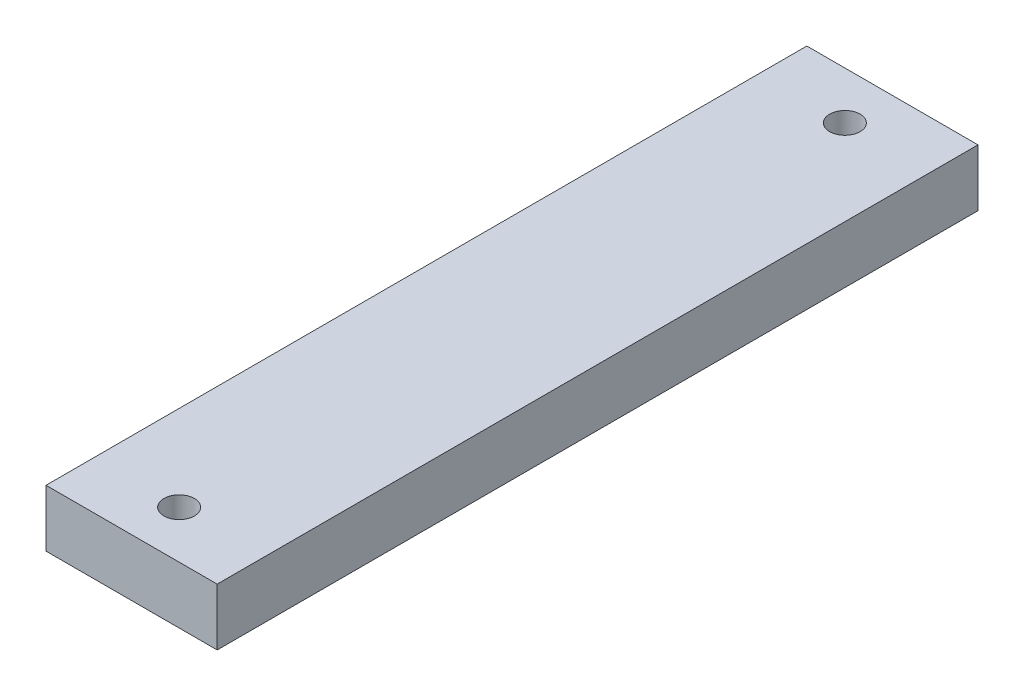
ISO-10303-21;
HEADER;
FILE_DESCRIPTION(('STEP AP214'),'2;1');
FILE_NAME('part.step','',(''),(''),'','','');
FILE_SCHEMA(('AUTOMOTIVE_DESIGN { 1 0 10303 214 1 1 1 1 }'));
ENDSEC;
DATA;
#1=APPLICATION_CONTEXT('core data for automotive mechanical design processes');
#2=APPLICATION_PROTOCOL_DEFINITION('international standard','automotive_design',2000,#1);
#3=PRODUCT_CONTEXT('',#1,'mechanical');
#4=PRODUCT('Part','Part','',(#3));
#5=PRODUCT_RELATED_PRODUCT_CATEGORY('part','',(#4));
#6=PRODUCT_DEFINITION_FORMATION('','',#4);
#7=PRODUCT_DEFINITION_CONTEXT('part definition',#1,'design');
#8=PRODUCT_DEFINITION('design','',#6,#7);
#9=PRODUCT_DEFINITION_SHAPE('','',#8);
#10=(LENGTH_UNIT() NAMED_UNIT(*) SI_UNIT(.MILLI.,.METRE.));
#11=(NAMED_UNIT(*) PLANE_ANGLE_UNIT() SI_UNIT($,.RADIAN.));
#12=(NAMED_UNIT(*) SI_UNIT($,.STERADIAN.) SOLID_ANGLE_UNIT());
#13=UNCERTAINTY_MEASURE_WITH_UNIT(LENGTH_MEASURE(1.E-05),#10,'distance_accuracy_value','');
#14=(GEOMETRIC_REPRESENTATION_CONTEXT(3) GLOBAL_UNCERTAINTY_ASSIGNED_CONTEXT((#13)) GLOBAL_UNIT_ASSIGNED_CONTEXT((#10,
#11,#12)) REPRESENTATION_CONTEXT('',''));
#15=CARTESIAN_POINT('',(0.,0.,0.));
#16=DIRECTION('',(0.,0.,1.));
#17=DIRECTION('',(1.,0.,0.));
#18=AXIS2_PLACEMENT_3D('',#15,#16,#17);
#19=CARTESIAN_POINT('',(0.,6.,0.));
#20=DIRECTION('',(0.,-1.,0.));
#21=DIRECTION('',(0.,0.,-1.));
#22=AXIS2_PLACEMENT_3D('',#19,#20,#21);
#23=PLANE('',#22);
#24=DIRECTION('',(0.,0.,-1.));
#25=VECTOR('',#24,1.);
#26=CARTESIAN_POINT('',(9.,6.,40.));
#27=LINE('',#26,#25);
#28=CARTESIAN_POINT('',(9.,6.,40.));
#29=VERTEX_POINT('',#28);
#30=CARTESIAN_POINT('',(9.,6.,-40.));
#31=VERTEX_POINT('',#30);
#32=EDGE_CURVE('E98',#29,#31,#27,.T.);
#33=ORIENTED_EDGE('',*,*,#32,.T.);
#34=DIRECTION('',(-1.,0.,0.));
#35=VECTOR('',#34,1.);
#36=CARTESIAN_POINT('',(-9.,6.,-40.));
#37=LINE('',#36,#35);
#38=CARTESIAN_POINT('',(-9.,6.,-40.));
#39=VERTEX_POINT('',#38);
#40=EDGE_CURVE('E93',#31,#39,#37,.T.);
#41=ORIENTED_EDGE('',*,*,#40,.T.);
#42=DIRECTION('',(0.,0.,1.));
#43=VECTOR('',#42,1.);
#44=CARTESIAN_POINT('',(-9.,6.,40.));
#45=LINE('',#44,#43);
#46=CARTESIAN_POINT('',(-9.,6.,40.));
#47=VERTEX_POINT('',#46);
#48=EDGE_CURVE('E96',#39,#47,#45,.T.);
#49=ORIENTED_EDGE('',*,*,#48,.T.);
#50=DIRECTION('',(1.,0.,0.));
#51=VECTOR('',#50,1.);
#52=CARTESIAN_POINT('',(-9.,6.,40.));
#53=LINE('',#52,#51);
#54=EDGE_CURVE('E63',#47,#29,#53,.T.);
#55=ORIENTED_EDGE('',*,*,#54,.T.);
#56=EDGE_LOOP('',(#33,#41,#49,#55));
#57=FACE_BOUND('',#56,.T.);
#58=CARTESIAN_POINT('',(0.,6.,35.));
#59=DIRECTION('',(0.,1.,0.));
#60=DIRECTION('',(0.,0.,1.));
#61=AXIS2_PLACEMENT_3D('',#58,#59,#60);
#62=CIRCLE('',#61,1.6);
#63=CARTESIAN_POINT('',(0.,6.,36.6));
#64=VERTEX_POINT('',#63);
#65=EDGE_CURVE('E118',#64,#64,#62,.T.);
#66=ORIENTED_EDGE('',*,*,#65,.F.);
#67=EDGE_LOOP('',(#66));
#68=FACE_BOUND('',#67,.T.);
#69=CARTESIAN_POINT('',(0.,6.,-35.));
#70=DIRECTION('',(0.,1.,0.));
#71=DIRECTION('',(0.,0.,-1.));
#72=AXIS2_PLACEMENT_3D('',#69,#70,#71);
#73=CIRCLE('',#72,1.6);
#74=CARTESIAN_POINT('',(0.,6.,-36.6));
#75=VERTEX_POINT('',#74);
#76=EDGE_CURVE('E140',#75,#75,#73,.T.);
#77=ORIENTED_EDGE('',*,*,#76,.F.);
#78=EDGE_LOOP('',(#77));
#79=FACE_BOUND('',#78,.T.);
#80=ADVANCED_FACE('F45',(#57,#68,#79),#23,.F.);
#81=CARTESIAN_POINT('',(0.,0.,0.));
#82=DIRECTION('',(0.,-1.,0.));
#83=DIRECTION('',(0.,0.,-1.));
#84=AXIS2_PLACEMENT_3D('',#81,#82,#83);
#85=PLANE('',#84);
#86=CARTESIAN_POINT('',(0.,0.,35.));
#87=DIRECTION('',(0.,1.,0.));
#88=DIRECTION('',(0.,0.,1.));
#89=AXIS2_PLACEMENT_3D('',#86,#87,#88);
#90=CIRCLE('',#89,1.6);
#91=CARTESIAN_POINT('',(0.,0.,36.6));
#92=VERTEX_POINT('',#91);
#93=EDGE_CURVE('E136',#92,#92,#90,.T.);
#94=ORIENTED_EDGE('',*,*,#93,.T.);
#95=EDGE_LOOP('',(#94));
#96=FACE_BOUND('',#95,.T.);
#97=DIRECTION('',(0.,0.,-1.));
#98=VECTOR('',#97,1.);
#99=CARTESIAN_POINT('',(9.,0.,40.));
#100=LINE('',#99,#98);
#101=CARTESIAN_POINT('',(9.,0.,40.));
#102=VERTEX_POINT('',#101);
#103=CARTESIAN_POINT('',(9.,0.,-40.));
#104=VERTEX_POINT('',#103);
#105=EDGE_CURVE('E114',#102,#104,#100,.T.);
#106=ORIENTED_EDGE('',*,*,#105,.F.);
#107=DIRECTION('',(1.,0.,0.));
#108=VECTOR('',#107,1.);
#109=CARTESIAN_POINT('',(-9.,0.,40.));
#110=LINE('',#109,#108);
#111=CARTESIAN_POINT('',(-9.,0.,40.));
#112=VERTEX_POINT('',#111);
#113=EDGE_CURVE('E86',#112,#102,#110,.T.);
#114=ORIENTED_EDGE('',*,*,#113,.F.);
#115=DIRECTION('',(0.,0.,1.));
#116=VECTOR('',#115,1.);
#117=CARTESIAN_POINT('',(-9.,0.,40.));
#118=LINE('',#117,#116);
#119=CARTESIAN_POINT('',(-9.,0.,-40.));
#120=VERTEX_POINT('',#119);
#121=EDGE_CURVE('E80',#120,#112,#118,.T.);
#122=ORIENTED_EDGE('',*,*,#121,.F.);
#123=DIRECTION('',(-1.,0.,0.));
#124=VECTOR('',#123,1.);
#125=CARTESIAN_POINT('',(-9.,0.,-40.));
#126=LINE('',#125,#124);
#127=EDGE_CURVE('E103',#104,#120,#126,.T.);
#128=ORIENTED_EDGE('',*,*,#127,.F.);
#129=EDGE_LOOP('',(#106,#114,#122,#128));
#130=FACE_BOUND('',#129,.T.);
#131=CARTESIAN_POINT('',(0.,0.,-35.));
#132=DIRECTION('',(0.,1.,0.));
#133=DIRECTION('',(0.,0.,-1.));
#134=AXIS2_PLACEMENT_3D('',#131,#132,#133);
#135=CIRCLE('',#134,1.6);
#136=CARTESIAN_POINT('',(0.,0.,-36.6));
#137=VERTEX_POINT('',#136);
#138=EDGE_CURVE('E144',#137,#137,#135,.T.);
#139=ORIENTED_EDGE('',*,*,#138,.T.);
#140=EDGE_LOOP('',(#139));
#141=FACE_BOUND('',#140,.T.);
#142=ADVANCED_FACE('F131',(#96,#130,#141),#85,.T.);
#143=CARTESIAN_POINT('',(9.,6.,40.));
#144=DIRECTION('',(-1.,0.,0.));
#145=DIRECTION('',(0.,0.,1.));
#146=AXIS2_PLACEMENT_3D('',#143,#144,#145);
#147=PLANE('',#146);
#148=ORIENTED_EDGE('',*,*,#105,.T.);
#149=DIRECTION('',(0.,-1.,0.));
#150=VECTOR('',#149,1.);
#151=CARTESIAN_POINT('',(9.,6.,-40.));
#152=LINE('',#151,#150);
#153=EDGE_CURVE('E11',#31,#104,#152,.T.);
#154=ORIENTED_EDGE('',*,*,#153,.F.);
#155=ORIENTED_EDGE('',*,*,#32,.F.);
#156=DIRECTION('',(0.,-1.,0.));
#157=VECTOR('',#156,1.);
#158=CARTESIAN_POINT('',(9.,6.,40.));
#159=LINE('',#158,#157);
#160=EDGE_CURVE('E110',#29,#102,#159,.T.);
#161=ORIENTED_EDGE('',*,*,#160,.T.);
#162=EDGE_LOOP('',(#148,#154,#155,#161));
#163=FACE_BOUND('',#162,.T.);
#164=ADVANCED_FACE('F47',(#163),#147,.F.);
#165=CARTESIAN_POINT('',(-9.,6.,-40.));
#166=DIRECTION('',(0.,0.,1.));
#167=DIRECTION('',(1.,0.,0.));
#168=AXIS2_PLACEMENT_3D('',#165,#166,#167);
#169=PLANE('',#168);
#170=ORIENTED_EDGE('',*,*,#127,.T.);
#171=DIRECTION('',(0.,-1.,0.));
#172=VECTOR('',#171,1.);
#173=CARTESIAN_POINT('',(-9.,6.,-40.));
#174=LINE('',#173,#172);
#175=EDGE_CURVE('E55',#39,#120,#174,.T.);
#176=ORIENTED_EDGE('',*,*,#175,.F.);
#177=ORIENTED_EDGE('',*,*,#40,.F.);
#178=ORIENTED_EDGE('',*,*,#153,.T.);
#179=EDGE_LOOP('',(#170,#176,#177,#178));
#180=FACE_BOUND('',#179,.T.);
#181=ADVANCED_FACE('F102',(#180),#169,.F.);
#182=CARTESIAN_POINT('',(-9.,6.,40.));
#183=DIRECTION('',(1.,0.,0.));
#184=DIRECTION('',(0.,0.,-1.));
#185=AXIS2_PLACEMENT_3D('',#182,#183,#184);
#186=PLANE('',#185);
#187=ORIENTED_EDGE('',*,*,#121,.T.);
#188=DIRECTION('',(0.,-1.,0.));
#189=VECTOR('',#188,1.);
#190=CARTESIAN_POINT('',(-9.,6.,40.));
#191=LINE('',#190,#189);
#192=EDGE_CURVE('E105',#47,#112,#191,.T.);
#193=ORIENTED_EDGE('',*,*,#192,.F.);
#194=ORIENTED_EDGE('',*,*,#48,.F.);
#195=ORIENTED_EDGE('',*,*,#175,.T.);
#196=EDGE_LOOP('',(#187,#193,#194,#195));
#197=FACE_BOUND('',#196,.T.);
#198=ADVANCED_FACE('F106',(#197),#186,.F.);
#199=CARTESIAN_POINT('',(-9.,6.,40.));
#200=DIRECTION('',(0.,0.,-1.));
#201=DIRECTION('',(-1.,0.,0.));
#202=AXIS2_PLACEMENT_3D('',#199,#200,#201);
#203=PLANE('',#202);
#204=ORIENTED_EDGE('',*,*,#113,.T.);
#205=ORIENTED_EDGE('',*,*,#160,.F.);
#206=ORIENTED_EDGE('',*,*,#54,.F.);
#207=ORIENTED_EDGE('',*,*,#192,.T.);
#208=EDGE_LOOP('',(#204,#205,#206,#207));
#209=FACE_BOUND('',#208,.T.);
#210=ADVANCED_FACE('F128',(#209),#203,.F.);
#211=CARTESIAN_POINT('',(0.,6.,35.));
#212=DIRECTION('',(0.,-1.,0.));
#213=DIRECTION('',(0.,0.,-1.));
#214=AXIS2_PLACEMENT_3D('',#211,#212,#213);
#215=CYLINDRICAL_SURFACE('',#214,1.6);
#216=ORIENTED_EDGE('',*,*,#65,.T.);
#217=EDGE_LOOP('',(#216));
#218=FACE_BOUND('',#217,.T.);
#219=ORIENTED_EDGE('',*,*,#93,.F.);
#220=EDGE_LOOP('',(#219));
#221=FACE_BOUND('',#220,.T.);
#222=ADVANCED_FACE('F163',(#218,#221),#215,.F.);
#223=CARTESIAN_POINT('',(0.,6.,-35.));
#224=DIRECTION('',(0.,-1.,0.));
#225=DIRECTION('',(0.,0.,-1.));
#226=AXIS2_PLACEMENT_3D('',#223,#224,#225);
#227=CYLINDRICAL_SURFACE('',#226,1.6);
#228=ORIENTED_EDGE('',*,*,#76,.T.);
#229=EDGE_LOOP('',(#228));
#230=FACE_BOUND('',#229,.T.);
#231=ORIENTED_EDGE('',*,*,#138,.F.);
#232=EDGE_LOOP('',(#231));
#233=FACE_BOUND('',#232,.T.);
#234=ADVANCED_FACE('F152',(#230,#233),#227,.F.);
#235=CLOSED_SHELL('',(#80,#142,#164,#181,#198,#210,#222,#234));
#236=MANIFOLD_SOLID_BREP('B2',#235);
#237=ADVANCED_BREP_SHAPE_REPRESENTATION('',(#18,#236),#14);
#238=SHAPE_DEFINITION_REPRESENTATION(#9,#237);
ENDSEC;
END-ISO-10303-21;
